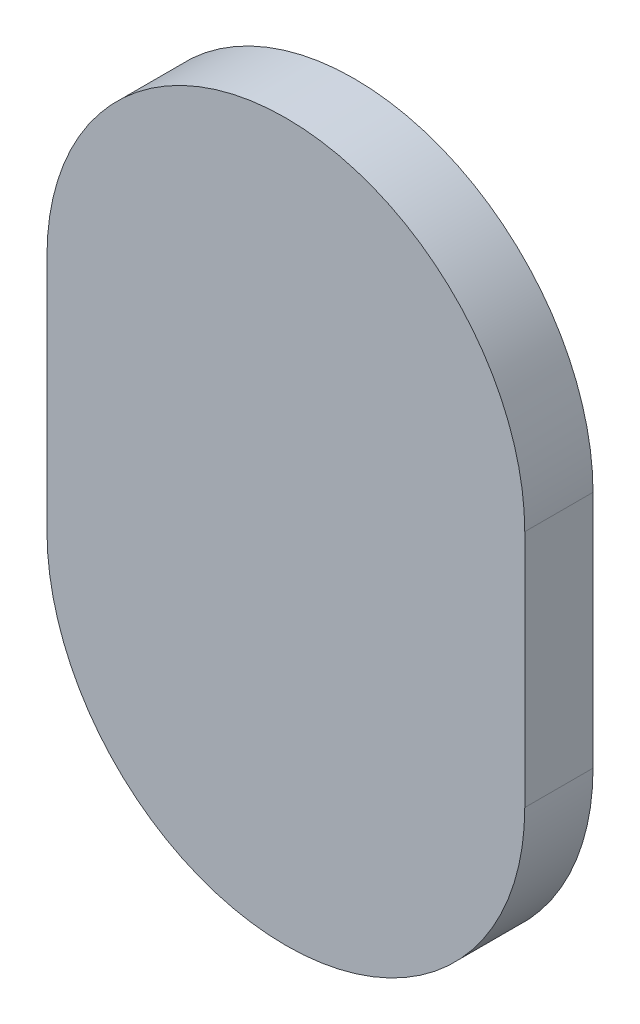
ISO-10303-21;
HEADER;
FILE_DESCRIPTION(('STEP AP214'),'2;1');
FILE_NAME('part.step','',(''),(''),'','','');
FILE_SCHEMA(('AUTOMOTIVE_DESIGN { 1 0 10303 214 1 1 1 1 }'));
ENDSEC;
DATA;
#1=APPLICATION_CONTEXT('core data for automotive mechanical design processes');
#2=APPLICATION_PROTOCOL_DEFINITION('international standard','automotive_design',2000,#1);
#3=PRODUCT_CONTEXT('',#1,'mechanical');
#4=PRODUCT('Part','Part','',(#3));
#5=PRODUCT_RELATED_PRODUCT_CATEGORY('part','',(#4));
#6=PRODUCT_DEFINITION_FORMATION('','',#4);
#7=PRODUCT_DEFINITION_CONTEXT('part definition',#1,'design');
#8=PRODUCT_DEFINITION('design','',#6,#7);
#9=PRODUCT_DEFINITION_SHAPE('','',#8);
#10=(LENGTH_UNIT() NAMED_UNIT(*) SI_UNIT(.MILLI.,.METRE.));
#11=(NAMED_UNIT(*) PLANE_ANGLE_UNIT() SI_UNIT($,.RADIAN.));
#12=(NAMED_UNIT(*) SI_UNIT($,.STERADIAN.) SOLID_ANGLE_UNIT());
#13=UNCERTAINTY_MEASURE_WITH_UNIT(LENGTH_MEASURE(1.E-05),#10,'distance_accuracy_value','');
#14=(GEOMETRIC_REPRESENTATION_CONTEXT(3) GLOBAL_UNCERTAINTY_ASSIGNED_CONTEXT((#13)) GLOBAL_UNIT_ASSIGNED_CONTEXT((#10,
#11,#12)) REPRESENTATION_CONTEXT('',''));
#15=CARTESIAN_POINT('',(0.,0.,0.));
#16=DIRECTION('',(0.,0.,1.));
#17=DIRECTION('',(1.,0.,0.));
#18=AXIS2_PLACEMENT_3D('',#15,#16,#17);
#19=CARTESIAN_POINT('',(35.,0.,10.));
#20=DIRECTION('',(1.,0.,0.));
#21=DIRECTION('',(0.,0.,-1.));
#22=AXIS2_PLACEMENT_3D('',#19,#20,#21);
#23=PLANE('',#22);
#24=DIRECTION('',(0.,-1.,0.));
#25=VECTOR('',#24,1.);
#26=CARTESIAN_POINT('',(35.,0.,0.));
#27=LINE('',#26,#25);
#28=CARTESIAN_POINT('',(35.,35.,0.));
#29=VERTEX_POINT('',#28);
#30=CARTESIAN_POINT('',(35.,0.,0.));
#31=VERTEX_POINT('',#30);
#32=EDGE_CURVE('E105',#29,#31,#27,.T.);
#33=ORIENTED_EDGE('',*,*,#32,.F.);
#34=DIRECTION('',(0.,0.,-1.));
#35=VECTOR('',#34,1.);
#36=CARTESIAN_POINT('',(35.,35.,10.));
#37=LINE('',#36,#35);
#38=CARTESIAN_POINT('',(35.,35.,10.));
#39=VERTEX_POINT('',#38);
#40=EDGE_CURVE('E11',#39,#29,#37,.T.);
#41=ORIENTED_EDGE('',*,*,#40,.F.);
#42=DIRECTION('',(0.,-1.,0.));
#43=VECTOR('',#42,1.);
#44=CARTESIAN_POINT('',(35.,0.,10.));
#45=LINE('',#44,#43);
#46=CARTESIAN_POINT('',(35.,0.,10.));
#47=VERTEX_POINT('',#46);
#48=EDGE_CURVE('E93',#39,#47,#45,.T.);
#49=ORIENTED_EDGE('',*,*,#48,.T.);
#50=DIRECTION('',(0.,0.,-1.));
#51=VECTOR('',#50,1.);
#52=CARTESIAN_POINT('',(35.,0.,10.));
#53=LINE('',#52,#51);
#54=EDGE_CURVE('E82',#47,#31,#53,.T.);
#55=ORIENTED_EDGE('',*,*,#54,.T.);
#56=EDGE_LOOP('',(#33,#41,#49,#55));
#57=FACE_BOUND('',#56,.T.);
#58=ADVANCED_FACE('F43',(#57),#23,.T.);
#59=CARTESIAN_POINT('',(0.,35.,10.));
#60=DIRECTION('',(0.,0.,-1.));
#61=DIRECTION('',(-1.,0.,0.));
#62=AXIS2_PLACEMENT_3D('',#59,#60,#61);
#63=CYLINDRICAL_SURFACE('',#62,35.);
#64=CARTESIAN_POINT('',(0.,35.,0.));
#65=DIRECTION('',(0.,0.,1.));
#66=DIRECTION('',(1.,0.,0.));
#67=AXIS2_PLACEMENT_3D('',#64,#65,#66);
#68=CIRCLE('',#67,35.);
#69=CARTESIAN_POINT('',(-35.,35.,0.));
#70=VERTEX_POINT('',#69);
#71=EDGE_CURVE('E98',#29,#70,#68,.T.);
#72=ORIENTED_EDGE('',*,*,#71,.T.);
#73=DIRECTION('',(0.,0.,-1.));
#74=VECTOR('',#73,1.);
#75=CARTESIAN_POINT('',(-35.,35.,10.));
#76=LINE('',#75,#74);
#77=CARTESIAN_POINT('',(-35.,35.,10.));
#78=VERTEX_POINT('',#77);
#79=EDGE_CURVE('E51',#78,#70,#76,.T.);
#80=ORIENTED_EDGE('',*,*,#79,.F.);
#81=CARTESIAN_POINT('',(0.,35.,10.));
#82=DIRECTION('',(0.,0.,1.));
#83=DIRECTION('',(1.,0.,0.));
#84=AXIS2_PLACEMENT_3D('',#81,#82,#83);
#85=CIRCLE('',#84,35.);
#86=EDGE_CURVE('E88',#39,#78,#85,.T.);
#87=ORIENTED_EDGE('',*,*,#86,.F.);
#88=ORIENTED_EDGE('',*,*,#40,.T.);
#89=EDGE_LOOP('',(#72,#80,#87,#88));
#90=FACE_BOUND('',#89,.T.);
#91=ADVANCED_FACE('F96',(#90),#63,.T.);
#92=CARTESIAN_POINT('',(-35.,0.,10.));
#93=DIRECTION('',(1.,0.,0.));
#94=DIRECTION('',(0.,0.,-1.));
#95=AXIS2_PLACEMENT_3D('',#92,#93,#94);
#96=PLANE('',#95);
#97=DIRECTION('',(0.,-1.,0.));
#98=VECTOR('',#97,1.);
#99=CARTESIAN_POINT('',(-35.,0.,0.));
#100=LINE('',#99,#98);
#101=CARTESIAN_POINT('',(-35.,0.,0.));
#102=VERTEX_POINT('',#101);
#103=EDGE_CURVE('E75',#70,#102,#100,.T.);
#104=ORIENTED_EDGE('',*,*,#103,.T.);
#105=DIRECTION('',(0.,0.,-1.));
#106=VECTOR('',#105,1.);
#107=CARTESIAN_POINT('',(-35.,0.,10.));
#108=LINE('',#107,#106);
#109=CARTESIAN_POINT('',(-35.,0.,10.));
#110=VERTEX_POINT('',#109);
#111=EDGE_CURVE('E99',#110,#102,#108,.T.);
#112=ORIENTED_EDGE('',*,*,#111,.F.);
#113=DIRECTION('',(0.,-1.,0.));
#114=VECTOR('',#113,1.);
#115=CARTESIAN_POINT('',(-35.,0.,10.));
#116=LINE('',#115,#114);
#117=EDGE_CURVE('E92',#78,#110,#116,.T.);
#118=ORIENTED_EDGE('',*,*,#117,.F.);
#119=ORIENTED_EDGE('',*,*,#79,.T.);
#120=EDGE_LOOP('',(#104,#112,#118,#119));
#121=FACE_BOUND('',#120,.T.);
#122=ADVANCED_FACE('F100',(#121),#96,.F.);
#123=CARTESIAN_POINT('',(0.,0.,10.));
#124=DIRECTION('',(0.,0.,-1.));
#125=DIRECTION('',(-1.,0.,0.));
#126=AXIS2_PLACEMENT_3D('',#123,#124,#125);
#127=CYLINDRICAL_SURFACE('',#126,35.);
#128=CARTESIAN_POINT('',(0.,0.,0.));
#129=DIRECTION('',(0.,0.,1.));
#130=DIRECTION('',(1.,0.,0.));
#131=AXIS2_PLACEMENT_3D('',#128,#129,#130);
#132=CIRCLE('',#131,35.);
#133=EDGE_CURVE('E110',#102,#31,#132,.T.);
#134=ORIENTED_EDGE('',*,*,#133,.T.);
#135=ORIENTED_EDGE('',*,*,#54,.F.);
#136=CARTESIAN_POINT('',(0.,0.,10.));
#137=DIRECTION('',(0.,0.,1.));
#138=DIRECTION('',(1.,0.,0.));
#139=AXIS2_PLACEMENT_3D('',#136,#137,#138);
#140=CIRCLE('',#139,35.);
#141=EDGE_CURVE('E59',#110,#47,#140,.T.);
#142=ORIENTED_EDGE('',*,*,#141,.F.);
#143=ORIENTED_EDGE('',*,*,#111,.T.);
#144=EDGE_LOOP('',(#134,#135,#142,#143));
#145=FACE_BOUND('',#144,.T.);
#146=ADVANCED_FACE('F115',(#145),#127,.T.);
#147=CARTESIAN_POINT('',(0.,0.,10.));
#148=DIRECTION('',(0.,0.,1.));
#149=DIRECTION('',(1.,0.,0.));
#150=AXIS2_PLACEMENT_3D('',#147,#148,#149);
#151=PLANE('',#150);
#152=ORIENTED_EDGE('',*,*,#48,.F.);
#153=ORIENTED_EDGE('',*,*,#86,.T.);
#154=ORIENTED_EDGE('',*,*,#117,.T.);
#155=ORIENTED_EDGE('',*,*,#141,.T.);
#156=EDGE_LOOP('',(#152,#153,#154,#155));
#157=FACE_BOUND('',#156,.T.);
#158=ADVANCED_FACE('F90',(#157),#151,.T.);
#159=CARTESIAN_POINT('',(0.,0.,0.));
#160=DIRECTION('',(0.,0.,1.));
#161=DIRECTION('',(1.,0.,0.));
#162=AXIS2_PLACEMENT_3D('',#159,#160,#161);
#163=PLANE('',#162);
#164=ORIENTED_EDGE('',*,*,#32,.T.);
#165=ORIENTED_EDGE('',*,*,#133,.F.);
#166=ORIENTED_EDGE('',*,*,#103,.F.);
#167=ORIENTED_EDGE('',*,*,#71,.F.);
#168=EDGE_LOOP('',(#164,#165,#166,#167));
#169=FACE_BOUND('',#168,.T.);
#170=ADVANCED_FACE('F117',(#169),#163,.F.);
#171=CLOSED_SHELL('',(#58,#91,#122,#146,#158,#170));
#172=MANIFOLD_SOLID_BREP('B2',#171);
#173=ADVANCED_BREP_SHAPE_REPRESENTATION('',(#18,#172),#14);
#174=SHAPE_DEFINITION_REPRESENTATION(#9,#173);
ENDSEC;
END-ISO-10303-21;
